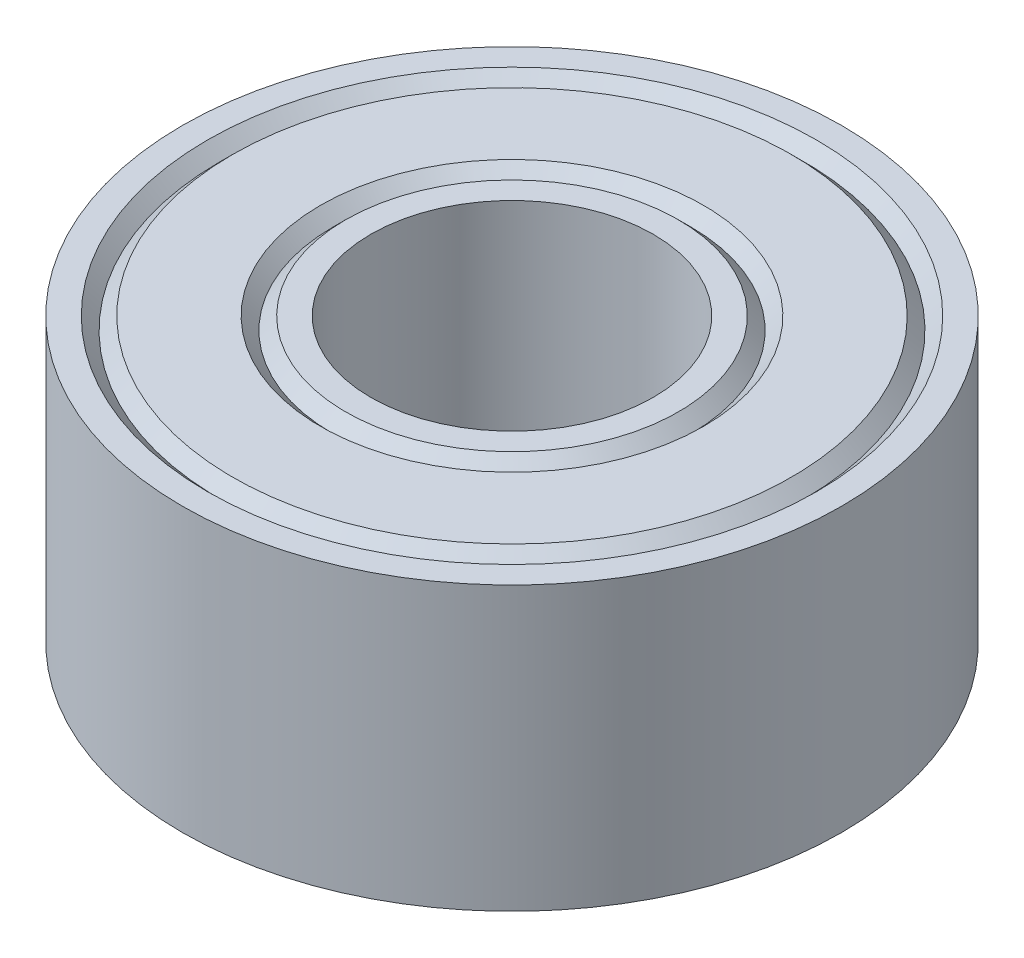
ISO-10303-21;
HEADER;
FILE_DESCRIPTION(('STEP AP214'),'2;1');
FILE_NAME('part.step','',(''),(''),'','','');
FILE_SCHEMA(('AUTOMOTIVE_DESIGN { 1 0 10303 214 1 1 1 1 }'));
ENDSEC;
DATA;
#1=APPLICATION_CONTEXT('core data for automotive mechanical design processes');
#2=APPLICATION_PROTOCOL_DEFINITION('international standard','automotive_design',2000,#1);
#3=PRODUCT_CONTEXT('',#1,'mechanical');
#4=PRODUCT('Part','Part','',(#3));
#5=PRODUCT_RELATED_PRODUCT_CATEGORY('part','',(#4));
#6=PRODUCT_DEFINITION_FORMATION('','',#4);
#7=PRODUCT_DEFINITION_CONTEXT('part definition',#1,'design');
#8=PRODUCT_DEFINITION('design','',#6,#7);
#9=PRODUCT_DEFINITION_SHAPE('','',#8);
#10=(LENGTH_UNIT() NAMED_UNIT(*) SI_UNIT(.MILLI.,.METRE.));
#11=(NAMED_UNIT(*) PLANE_ANGLE_UNIT() SI_UNIT($,.RADIAN.));
#12=(NAMED_UNIT(*) SI_UNIT($,.STERADIAN.) SOLID_ANGLE_UNIT());
#13=UNCERTAINTY_MEASURE_WITH_UNIT(LENGTH_MEASURE(1.E-05),#10,'distance_accuracy_value','');
#14=(GEOMETRIC_REPRESENTATION_CONTEXT(3) GLOBAL_UNCERTAINTY_ASSIGNED_CONTEXT((#13)) GLOBAL_UNIT_ASSIGNED_CONTEXT((#10,
#11,#12)) REPRESENTATION_CONTEXT('',''));
#15=CARTESIAN_POINT('',(0.,0.,0.));
#16=DIRECTION('',(0.,0.,1.));
#17=DIRECTION('',(1.,0.,0.));
#18=AXIS2_PLACEMENT_3D('',#15,#16,#17);
#19=CARTESIAN_POINT('',(0.,1.5,0.));
#20=DIRECTION('',(0.,1.,0.));
#21=DIRECTION('',(-1.,0.,0.));
#22=AXIS2_PLACEMENT_3D('',#19,#20,#21);
#23=CYLINDRICAL_SURFACE('',#22,1.5);
#24=CARTESIAN_POINT('',(0.,1.49999999999999,0.));
#25=DIRECTION('',(0.,1.,0.));
#26=DIRECTION('',(-1.,0.,0.));
#27=AXIS2_PLACEMENT_3D('',#24,#25,#26);
#28=CIRCLE('',#27,1.5);
#29=CARTESIAN_POINT('',(-1.5,1.49999999999999,0.));
#30=VERTEX_POINT('',#29);
#31=EDGE_CURVE('E83',#30,#30,#28,.T.);
#32=ORIENTED_EDGE('',*,*,#31,.T.);
#33=EDGE_LOOP('',(#32));
#34=FACE_BOUND('',#33,.T.);
#35=CARTESIAN_POINT('',(0.,-1.49999999999999,0.));
#36=DIRECTION('',(0.,1.,0.));
#37=DIRECTION('',(-1.,0.,0.));
#38=AXIS2_PLACEMENT_3D('',#35,#36,#37);
#39=CIRCLE('',#38,1.5);
#40=CARTESIAN_POINT('',(-1.5,-1.49999999999999,0.));
#41=VERTEX_POINT('',#40);
#42=EDGE_CURVE('E10',#41,#41,#39,.T.);
#43=ORIENTED_EDGE('',*,*,#42,.F.);
#44=EDGE_LOOP('',(#43));
#45=FACE_BOUND('',#44,.T.);
#46=ADVANCED_FACE('F31',(#34,#45),#23,.F.);
#47=CARTESIAN_POINT('',(-1.5,-1.5,0.));
#48=DIRECTION('',(0.,-1.,0.));
#49=DIRECTION('',(1.,0.,0.));
#50=AXIS2_PLACEMENT_3D('',#47,#48,#49);
#51=PLANE('',#50);
#52=ORIENTED_EDGE('',*,*,#42,.T.);
#53=EDGE_LOOP('',(#52));
#54=FACE_BOUND('',#53,.T.);
#55=CARTESIAN_POINT('',(0.,-1.5,0.));
#56=DIRECTION('',(0.,1.,0.));
#57=DIRECTION('',(-1.,0.,0.));
#58=AXIS2_PLACEMENT_3D('',#55,#56,#57);
#59=CIRCLE('',#58,1.76666666666666);
#60=CARTESIAN_POINT('',(-1.76666666666666,-1.5,0.));
#61=VERTEX_POINT('',#60);
#62=EDGE_CURVE('E37',#61,#61,#59,.T.);
#63=ORIENTED_EDGE('',*,*,#62,.F.);
#64=EDGE_LOOP('',(#63));
#65=FACE_BOUND('',#64,.T.);
#66=ADVANCED_FACE('F101',(#54,#65),#51,.T.);
#67=CARTESIAN_POINT('',(0.,-1.36666666666667,0.));
#68=DIRECTION('',(0.,1.,0.));
#69=DIRECTION('',(-1.,0.,0.));
#70=AXIS2_PLACEMENT_3D('',#67,#68,#69);
#71=CONICAL_SURFACE('',#70,1.9,0.785398163397459);
#72=ORIENTED_EDGE('',*,*,#62,.T.);
#73=EDGE_LOOP('',(#72));
#74=FACE_BOUND('',#73,.T.);
#75=CARTESIAN_POINT('',(0.,-1.36666666666667,0.));
#76=DIRECTION('',(0.,1.,0.));
#77=DIRECTION('',(-1.,0.,0.));
#78=AXIS2_PLACEMENT_3D('',#75,#76,#77);
#79=CIRCLE('',#78,1.9);
#80=CARTESIAN_POINT('',(-1.9,-1.36666666666667,0.));
#81=VERTEX_POINT('',#80);
#82=EDGE_CURVE('E41',#81,#81,#79,.T.);
#83=ORIENTED_EDGE('',*,*,#82,.F.);
#84=EDGE_LOOP('',(#83));
#85=FACE_BOUND('',#84,.T.);
#86=ADVANCED_FACE('F105',(#74,#85),#71,.T.);
#87=CARTESIAN_POINT('',(0.,-1.5,0.));
#88=DIRECTION('',(0.,-1.,0.));
#89=DIRECTION('',(1.,0.,0.));
#90=AXIS2_PLACEMENT_3D('',#87,#88,#89);
#91=CONICAL_SURFACE('',#90,2.03333333333333,0.785398163397446);
#92=ORIENTED_EDGE('',*,*,#82,.T.);
#93=EDGE_LOOP('',(#92));
#94=FACE_BOUND('',#93,.T.);
#95=CARTESIAN_POINT('',(0.,-1.5,0.));
#96=DIRECTION('',(0.,1.,0.));
#97=DIRECTION('',(-1.,0.,0.));
#98=AXIS2_PLACEMENT_3D('',#95,#96,#97);
#99=CIRCLE('',#98,2.03333333333333);
#100=CARTESIAN_POINT('',(-2.03333333333333,-1.5,0.));
#101=VERTEX_POINT('',#100);
#102=EDGE_CURVE('E45',#101,#101,#99,.T.);
#103=ORIENTED_EDGE('',*,*,#102,.F.);
#104=EDGE_LOOP('',(#103));
#105=FACE_BOUND('',#104,.T.);
#106=ADVANCED_FACE('F109',(#94,#105),#91,.F.);
#107=CARTESIAN_POINT('',(-2.03333333333333,-1.5,0.));
#108=DIRECTION('',(0.,-1.,0.));
#109=DIRECTION('',(1.,0.,0.));
#110=AXIS2_PLACEMENT_3D('',#107,#108,#109);
#111=PLANE('',#110);
#112=ORIENTED_EDGE('',*,*,#102,.T.);
#113=EDGE_LOOP('',(#112));
#114=FACE_BOUND('',#113,.T.);
#115=CARTESIAN_POINT('',(0.,-1.5,0.));
#116=DIRECTION('',(0.,1.,0.));
#117=DIRECTION('',(-1.,0.,0.));
#118=AXIS2_PLACEMENT_3D('',#115,#116,#117);
#119=CIRCLE('',#118,2.96666666666667);
#120=CARTESIAN_POINT('',(-2.96666666666667,-1.5,0.));
#121=VERTEX_POINT('',#120);
#122=EDGE_CURVE('E50',#121,#121,#119,.T.);
#123=ORIENTED_EDGE('',*,*,#122,.F.);
#124=EDGE_LOOP('',(#123));
#125=FACE_BOUND('',#124,.T.);
#126=ADVANCED_FACE('F115',(#114,#125),#111,.T.);
#127=CARTESIAN_POINT('',(0.,-1.36666666666667,0.));
#128=DIRECTION('',(0.,1.,0.));
#129=DIRECTION('',(-1.,0.,0.));
#130=AXIS2_PLACEMENT_3D('',#127,#128,#129);
#131=CONICAL_SURFACE('',#130,3.1,0.78539816339745);
#132=ORIENTED_EDGE('',*,*,#122,.T.);
#133=EDGE_LOOP('',(#132));
#134=FACE_BOUND('',#133,.T.);
#135=CARTESIAN_POINT('',(0.,-1.36666666666667,0.));
#136=DIRECTION('',(0.,1.,0.));
#137=DIRECTION('',(-1.,0.,0.));
#138=AXIS2_PLACEMENT_3D('',#135,#136,#137);
#139=CIRCLE('',#138,3.1);
#140=CARTESIAN_POINT('',(-3.1,-1.36666666666667,0.));
#141=VERTEX_POINT('',#140);
#142=EDGE_CURVE('E53',#141,#141,#139,.T.);
#143=ORIENTED_EDGE('',*,*,#142,.F.);
#144=EDGE_LOOP('',(#143));
#145=FACE_BOUND('',#144,.T.);
#146=ADVANCED_FACE('F119',(#134,#145),#131,.T.);
#147=CARTESIAN_POINT('',(0.,-1.5,0.));
#148=DIRECTION('',(0.,-1.,0.));
#149=DIRECTION('',(1.,0.,0.));
#150=AXIS2_PLACEMENT_3D('',#147,#148,#149);
#151=CONICAL_SURFACE('',#150,3.23333333333333,0.78539816339745);
#152=ORIENTED_EDGE('',*,*,#142,.T.);
#153=EDGE_LOOP('',(#152));
#154=FACE_BOUND('',#153,.T.);
#155=CARTESIAN_POINT('',(0.,-1.5,0.));
#156=DIRECTION('',(0.,1.,0.));
#157=DIRECTION('',(-1.,0.,0.));
#158=AXIS2_PLACEMENT_3D('',#155,#156,#157);
#159=CIRCLE('',#158,3.23333333333333);
#160=CARTESIAN_POINT('',(-3.23333333333333,-1.5,0.));
#161=VERTEX_POINT('',#160);
#162=EDGE_CURVE('E56',#161,#161,#159,.T.);
#163=ORIENTED_EDGE('',*,*,#162,.F.);
#164=EDGE_LOOP('',(#163));
#165=FACE_BOUND('',#164,.T.);
#166=ADVANCED_FACE('F123',(#154,#165),#151,.F.);
#167=CARTESIAN_POINT('',(-3.23333333333333,-1.5,0.));
#168=DIRECTION('',(0.,-1.,0.));
#169=DIRECTION('',(1.,0.,0.));
#170=AXIS2_PLACEMENT_3D('',#167,#168,#169);
#171=PLANE('',#170);
#172=ORIENTED_EDGE('',*,*,#162,.T.);
#173=EDGE_LOOP('',(#172));
#174=FACE_BOUND('',#173,.T.);
#175=CARTESIAN_POINT('',(0.,-1.5,0.));
#176=DIRECTION('',(0.,1.,0.));
#177=DIRECTION('',(-1.,0.,0.));
#178=AXIS2_PLACEMENT_3D('',#175,#176,#177);
#179=CIRCLE('',#178,3.5);
#180=CARTESIAN_POINT('',(-3.5,-1.5,0.));
#181=VERTEX_POINT('',#180);
#182=EDGE_CURVE('E59',#181,#181,#179,.T.);
#183=ORIENTED_EDGE('',*,*,#182,.F.);
#184=EDGE_LOOP('',(#183));
#185=FACE_BOUND('',#184,.T.);
#186=ADVANCED_FACE('F127',(#174,#185),#171,.T.);
#187=CARTESIAN_POINT('',(0.,1.5,0.));
#188=DIRECTION('',(0.,1.,0.));
#189=DIRECTION('',(-1.,0.,0.));
#190=AXIS2_PLACEMENT_3D('',#187,#188,#189);
#191=CYLINDRICAL_SURFACE('',#190,3.5);
#192=ORIENTED_EDGE('',*,*,#182,.T.);
#193=EDGE_LOOP('',(#192));
#194=FACE_BOUND('',#193,.T.);
#195=CARTESIAN_POINT('',(0.,1.5,0.));
#196=DIRECTION('',(0.,1.,0.));
#197=DIRECTION('',(-1.,0.,0.));
#198=AXIS2_PLACEMENT_3D('',#195,#196,#197);
#199=CIRCLE('',#198,3.5);
#200=CARTESIAN_POINT('',(-3.5,1.5,0.));
#201=VERTEX_POINT('',#200);
#202=EDGE_CURVE('E62',#201,#201,#199,.T.);
#203=ORIENTED_EDGE('',*,*,#202,.F.);
#204=EDGE_LOOP('',(#203));
#205=FACE_BOUND('',#204,.T.);
#206=ADVANCED_FACE('F131',(#194,#205),#191,.T.);
#207=CARTESIAN_POINT('',(-3.23333333333333,1.5,0.));
#208=DIRECTION('',(0.,1.,0.));
#209=DIRECTION('',(-1.,0.,0.));
#210=AXIS2_PLACEMENT_3D('',#207,#208,#209);
#211=PLANE('',#210);
#212=ORIENTED_EDGE('',*,*,#202,.T.);
#213=EDGE_LOOP('',(#212));
#214=FACE_BOUND('',#213,.T.);
#215=CARTESIAN_POINT('',(0.,1.5,0.));
#216=DIRECTION('',(0.,1.,0.));
#217=DIRECTION('',(-1.,0.,0.));
#218=AXIS2_PLACEMENT_3D('',#215,#216,#217);
#219=CIRCLE('',#218,3.23333333333333);
#220=CARTESIAN_POINT('',(-3.23333333333333,1.5,0.));
#221=VERTEX_POINT('',#220);
#222=EDGE_CURVE('E65',#221,#221,#219,.T.);
#223=ORIENTED_EDGE('',*,*,#222,.F.);
#224=EDGE_LOOP('',(#223));
#225=FACE_BOUND('',#224,.T.);
#226=ADVANCED_FACE('F135',(#214,#225),#211,.T.);
#227=CARTESIAN_POINT('',(0.,1.36666666666667,0.));
#228=DIRECTION('',(0.,1.,0.));
#229=DIRECTION('',(-1.,0.,0.));
#230=AXIS2_PLACEMENT_3D('',#227,#228,#229);
#231=CONICAL_SURFACE('',#230,3.1,0.785398163397454);
#232=ORIENTED_EDGE('',*,*,#222,.T.);
#233=EDGE_LOOP('',(#232));
#234=FACE_BOUND('',#233,.T.);
#235=CARTESIAN_POINT('',(0.,1.36666666666667,0.));
#236=DIRECTION('',(0.,1.,0.));
#237=DIRECTION('',(-1.,0.,0.));
#238=AXIS2_PLACEMENT_3D('',#235,#236,#237);
#239=CIRCLE('',#238,3.1);
#240=CARTESIAN_POINT('',(-3.1,1.36666666666667,0.));
#241=VERTEX_POINT('',#240);
#242=EDGE_CURVE('E68',#241,#241,#239,.T.);
#243=ORIENTED_EDGE('',*,*,#242,.F.);
#244=EDGE_LOOP('',(#243));
#245=FACE_BOUND('',#244,.T.);
#246=ADVANCED_FACE('F139',(#234,#245),#231,.F.);
#247=CARTESIAN_POINT('',(0.,1.5,0.));
#248=DIRECTION('',(0.,-1.,0.));
#249=DIRECTION('',(1.,0.,0.));
#250=AXIS2_PLACEMENT_3D('',#247,#248,#249);
#251=CONICAL_SURFACE('',#250,2.96666666666667,0.785398163397448);
#252=ORIENTED_EDGE('',*,*,#242,.T.);
#253=EDGE_LOOP('',(#252));
#254=FACE_BOUND('',#253,.T.);
#255=CARTESIAN_POINT('',(0.,1.5,0.));
#256=DIRECTION('',(0.,1.,0.));
#257=DIRECTION('',(-1.,0.,0.));
#258=AXIS2_PLACEMENT_3D('',#255,#256,#257);
#259=CIRCLE('',#258,2.96666666666667);
#260=CARTESIAN_POINT('',(-2.96666666666667,1.5,0.));
#261=VERTEX_POINT('',#260);
#262=EDGE_CURVE('E71',#261,#261,#259,.T.);
#263=ORIENTED_EDGE('',*,*,#262,.F.);
#264=EDGE_LOOP('',(#263));
#265=FACE_BOUND('',#264,.T.);
#266=ADVANCED_FACE('F143',(#254,#265),#251,.T.);
#267=CARTESIAN_POINT('',(-2.03333333333333,1.5,0.));
#268=DIRECTION('',(0.,1.,0.));
#269=DIRECTION('',(-1.,0.,0.));
#270=AXIS2_PLACEMENT_3D('',#267,#268,#269);
#271=PLANE('',#270);
#272=ORIENTED_EDGE('',*,*,#262,.T.);
#273=EDGE_LOOP('',(#272));
#274=FACE_BOUND('',#273,.T.);
#275=CARTESIAN_POINT('',(0.,1.5,0.));
#276=DIRECTION('',(0.,1.,0.));
#277=DIRECTION('',(-1.,0.,0.));
#278=AXIS2_PLACEMENT_3D('',#275,#276,#277);
#279=CIRCLE('',#278,2.03333333333333);
#280=CARTESIAN_POINT('',(-2.03333333333333,1.5,0.));
#281=VERTEX_POINT('',#280);
#282=EDGE_CURVE('E74',#281,#281,#279,.T.);
#283=ORIENTED_EDGE('',*,*,#282,.F.);
#284=EDGE_LOOP('',(#283));
#285=FACE_BOUND('',#284,.T.);
#286=ADVANCED_FACE('F147',(#274,#285),#271,.T.);
#287=CARTESIAN_POINT('',(0.,1.36666666666667,0.));
#288=DIRECTION('',(0.,1.,0.));
#289=DIRECTION('',(-1.,0.,0.));
#290=AXIS2_PLACEMENT_3D('',#287,#288,#289);
#291=CONICAL_SURFACE('',#290,1.9,0.785398163397444);
#292=ORIENTED_EDGE('',*,*,#282,.T.);
#293=EDGE_LOOP('',(#292));
#294=FACE_BOUND('',#293,.T.);
#295=CARTESIAN_POINT('',(0.,1.36666666666667,0.));
#296=DIRECTION('',(0.,1.,0.));
#297=DIRECTION('',(-1.,0.,0.));
#298=AXIS2_PLACEMENT_3D('',#295,#296,#297);
#299=CIRCLE('',#298,1.9);
#300=CARTESIAN_POINT('',(-1.9,1.36666666666667,0.));
#301=VERTEX_POINT('',#300);
#302=EDGE_CURVE('E77',#301,#301,#299,.T.);
#303=ORIENTED_EDGE('',*,*,#302,.F.);
#304=EDGE_LOOP('',(#303));
#305=FACE_BOUND('',#304,.T.);
#306=ADVANCED_FACE('F97',(#294,#305),#291,.F.);
#307=CARTESIAN_POINT('',(0.,1.5,0.));
#308=DIRECTION('',(0.,-1.,0.));
#309=DIRECTION('',(1.,0.,0.));
#310=AXIS2_PLACEMENT_3D('',#307,#308,#309);
#311=CONICAL_SURFACE('',#310,1.76666666666666,0.785398163397455);
#312=ORIENTED_EDGE('',*,*,#302,.T.);
#313=EDGE_LOOP('',(#312));
#314=FACE_BOUND('',#313,.T.);
#315=CARTESIAN_POINT('',(0.,1.5,0.));
#316=DIRECTION('',(0.,1.,0.));
#317=DIRECTION('',(-1.,0.,0.));
#318=AXIS2_PLACEMENT_3D('',#315,#316,#317);
#319=CIRCLE('',#318,1.76666666666666);
#320=CARTESIAN_POINT('',(-1.76666666666666,1.5,0.));
#321=VERTEX_POINT('',#320);
#322=EDGE_CURVE('E80',#321,#321,#319,.T.);
#323=ORIENTED_EDGE('',*,*,#322,.F.);
#324=EDGE_LOOP('',(#323));
#325=FACE_BOUND('',#324,.T.);
#326=ADVANCED_FACE('F91',(#314,#325),#311,.T.);
#327=CARTESIAN_POINT('',(-1.5,1.5,0.));
#328=DIRECTION('',(0.,1.,0.));
#329=DIRECTION('',(-1.,0.,0.));
#330=AXIS2_PLACEMENT_3D('',#327,#328,#329);
#331=PLANE('',#330);
#332=ORIENTED_EDGE('',*,*,#322,.T.);
#333=EDGE_LOOP('',(#332));
#334=FACE_BOUND('',#333,.T.);
#335=ORIENTED_EDGE('',*,*,#31,.F.);
#336=EDGE_LOOP('',(#335));
#337=FACE_BOUND('',#336,.T.);
#338=ADVANCED_FACE('F89',(#334,#337),#331,.T.);
#339=CLOSED_SHELL('',(#46,#66,#86,#106,#126,#146,#166,#186,#206,#226,#246,#266,#286,#306,#326,#338));
#340=MANIFOLD_SOLID_BREP('B2',#339);
#341=ADVANCED_BREP_SHAPE_REPRESENTATION('',(#18,#340),#14);
#342=SHAPE_DEFINITION_REPRESENTATION(#9,#341);
ENDSEC;
END-ISO-10303-21;
